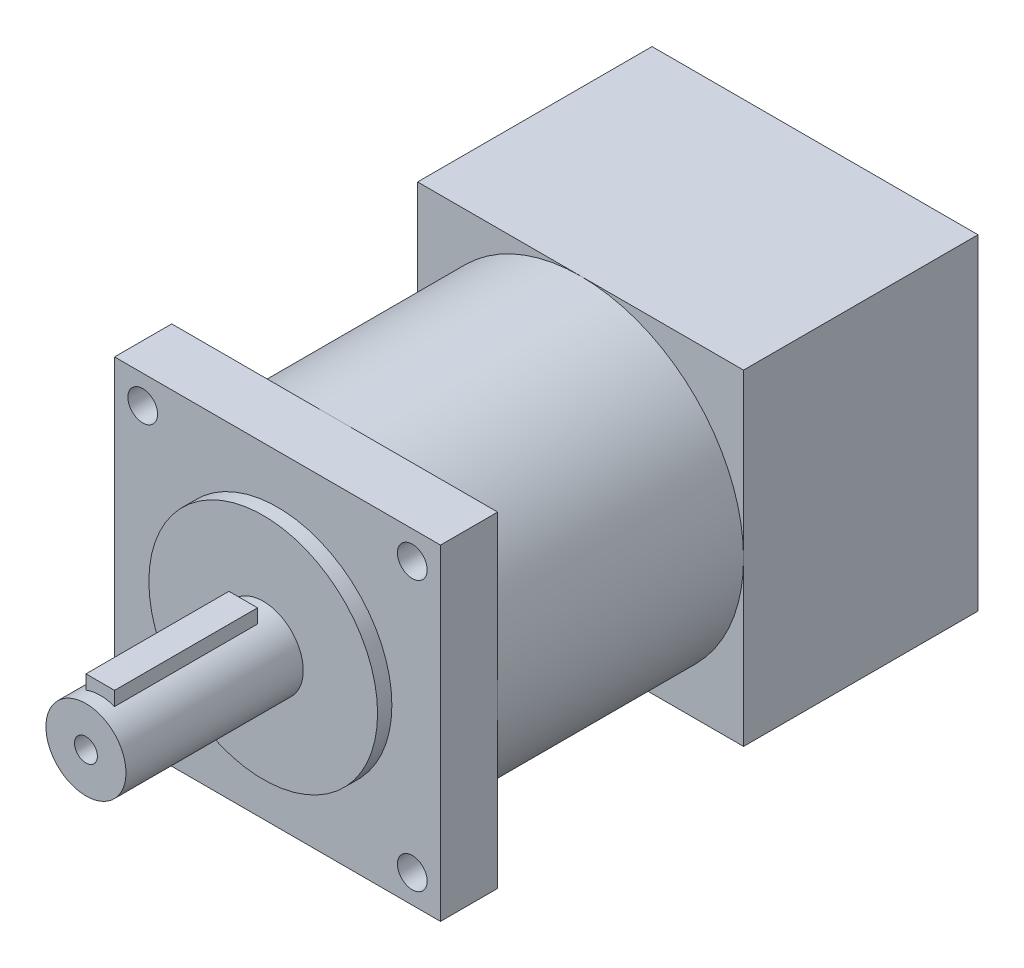
ISO-10303-21;
HEADER;
FILE_DESCRIPTION(('STEP AP214'),'2;1');
FILE_NAME('part.step','',(''),(''),'','','');
FILE_SCHEMA(('AUTOMOTIVE_DESIGN { 1 0 10303 214 1 1 1 1 }'));
ENDSEC;
DATA;
#1=APPLICATION_CONTEXT('core data for automotive mechanical design processes');
#2=APPLICATION_PROTOCOL_DEFINITION('international standard','automotive_design',2000,#1);
#3=PRODUCT_CONTEXT('',#1,'mechanical');
#4=PRODUCT('Part','Part','',(#3));
#5=PRODUCT_RELATED_PRODUCT_CATEGORY('part','',(#4));
#6=PRODUCT_DEFINITION_FORMATION('','',#4);
#7=PRODUCT_DEFINITION_CONTEXT('part definition',#1,'design');
#8=PRODUCT_DEFINITION('design','',#6,#7);
#9=PRODUCT_DEFINITION_SHAPE('','',#8);
#10=(LENGTH_UNIT() NAMED_UNIT(*) SI_UNIT(.MILLI.,.METRE.));
#11=(NAMED_UNIT(*) PLANE_ANGLE_UNIT() SI_UNIT($,.RADIAN.));
#12=(NAMED_UNIT(*) SI_UNIT($,.STERADIAN.) SOLID_ANGLE_UNIT());
#13=UNCERTAINTY_MEASURE_WITH_UNIT(LENGTH_MEASURE(1.E-05),#10,'distance_accuracy_value','');
#14=(GEOMETRIC_REPRESENTATION_CONTEXT(3) GLOBAL_UNCERTAINTY_ASSIGNED_CONTEXT((#13)) GLOBAL_UNIT_ASSIGNED_CONTEXT((#10,
#11,#12)) REPRESENTATION_CONTEXT('',''));
#15=CARTESIAN_POINT('',(0.,0.,0.));
#16=DIRECTION('',(0.,0.,1.));
#17=DIRECTION('',(1.,0.,0.));
#18=AXIS2_PLACEMENT_3D('',#15,#16,#17);
#19=CARTESIAN_POINT('',(0.,0.,127.5));
#20=DIRECTION('',(0.,0.,-1.));
#21=DIRECTION('',(-1.,0.,0.));
#22=AXIS2_PLACEMENT_3D('',#19,#20,#21);
#23=CYLINDRICAL_SURFACE('',#22,7.);
#24=CARTESIAN_POINT('',(0.,0.,96.5));
#25=DIRECTION('',(0.,0.,1.));
#26=DIRECTION('',(1.,0.,0.));
#27=AXIS2_PLACEMENT_3D('',#24,#25,#26);
#28=CIRCLE('',#27,7.);
#29=CARTESIAN_POINT('',(7.,0.,96.5));
#30=VERTEX_POINT('',#29);
#31=EDGE_CURVE('E246',#30,#30,#28,.T.);
#32=ORIENTED_EDGE('',*,*,#31,.T.);
#33=EDGE_LOOP('',(#32));
#34=FACE_BOUND('',#33,.T.);
#35=CARTESIAN_POINT('',(0.,0.,127.5));
#36=DIRECTION('',(0.,0.,1.));
#37=DIRECTION('',(1.,0.,0.));
#38=AXIS2_PLACEMENT_3D('',#35,#36,#37);
#39=CIRCLE('',#38,7.);
#40=CARTESIAN_POINT('',(7.,0.,127.5));
#41=VERTEX_POINT('',#40);
#42=EDGE_CURVE('E234',#41,#41,#39,.T.);
#43=ORIENTED_EDGE('',*,*,#42,.F.);
#44=EDGE_LOOP('',(#43));
#45=FACE_BOUND('',#44,.T.);
#46=CARTESIAN_POINT('',(0.,0.,100.));
#47=DIRECTION('',(0.,0.,1.));
#48=DIRECTION('',(1.,0.,0.));
#49=AXIS2_PLACEMENT_3D('',#46,#47,#48);
#50=CIRCLE('',#49,7.);
#51=CARTESIAN_POINT('',(2.5,6.53834841531101,100.));
#52=VERTEX_POINT('',#51);
#53=CARTESIAN_POINT('',(-2.5,6.53834841531101,100.));
#54=VERTEX_POINT('',#53);
#55=EDGE_CURVE('E11',#52,#54,#50,.T.);
#56=ORIENTED_EDGE('',*,*,#55,.F.);
#57=DIRECTION('',(0.,0.,-1.));
#58=VECTOR('',#57,1.);
#59=CARTESIAN_POINT('',(2.5,6.53834841531101,127.5));
#60=LINE('',#59,#58);
#61=CARTESIAN_POINT('',(2.5,6.53834841531101,125.));
#62=VERTEX_POINT('',#61);
#63=EDGE_CURVE('E156',#52,#62,#60,.F.);
#64=ORIENTED_EDGE('',*,*,#63,.T.);
#65=CARTESIAN_POINT('',(0.,0.,125.));
#66=DIRECTION('',(0.,0.,1.));
#67=DIRECTION('',(1.,0.,0.));
#68=AXIS2_PLACEMENT_3D('',#65,#66,#67);
#69=CIRCLE('',#68,7.);
#70=CARTESIAN_POINT('',(-2.5,6.53834841531101,125.));
#71=VERTEX_POINT('',#70);
#72=EDGE_CURVE('E300',#62,#71,#69,.T.);
#73=ORIENTED_EDGE('',*,*,#72,.T.);
#74=DIRECTION('',(0.,0.,-1.));
#75=VECTOR('',#74,1.);
#76=CARTESIAN_POINT('',(-2.5,6.53834841531101,127.5));
#77=LINE('',#76,#75);
#78=EDGE_CURVE('E43',#71,#54,#77,.T.);
#79=ORIENTED_EDGE('',*,*,#78,.T.);
#80=EDGE_LOOP('',(#56,#64,#73,#79));
#81=FACE_BOUND('',#80,.T.);
#82=ADVANCED_FACE('F35',(#34,#45,#81),#23,.T.);
#83=CARTESIAN_POINT('',(0.,0.,94.));
#84=DIRECTION('',(0.,0.,1.));
#85=DIRECTION('',(1.,0.,0.));
#86=AXIS2_PLACEMENT_3D('',#83,#84,#85);
#87=PLANE('',#86);
#88=CARTESIAN_POINT('',(0.,0.,94.));
#89=DIRECTION('',(0.,0.,1.));
#90=DIRECTION('',(1.,0.,0.));
#91=AXIS2_PLACEMENT_3D('',#88,#89,#90);
#92=CIRCLE('',#91,20.);
#93=CARTESIAN_POINT('',(20.,0.,94.));
#94=VERTEX_POINT('',#93);
#95=EDGE_CURVE('E250',#94,#94,#92,.T.);
#96=ORIENTED_EDGE('',*,*,#95,.F.);
#97=EDGE_LOOP('',(#96));
#98=FACE_BOUND('',#97,.T.);
#99=DIRECTION('',(1.,0.,0.));
#100=VECTOR('',#99,1.);
#101=CARTESIAN_POINT('',(-28.5,-28.5,94.));
#102=LINE('',#101,#100);
#103=CARTESIAN_POINT('',(-28.5,-28.5,94.));
#104=VERTEX_POINT('',#103);
#105=CARTESIAN_POINT('',(28.5,-28.5,94.));
#106=VERTEX_POINT('',#105);
#107=EDGE_CURVE('E228',#104,#106,#102,.T.);
#108=ORIENTED_EDGE('',*,*,#107,.T.);
#109=DIRECTION('',(0.,1.,0.));
#110=VECTOR('',#109,1.);
#111=CARTESIAN_POINT('',(28.5,-28.5,94.));
#112=LINE('',#111,#110);
#113=CARTESIAN_POINT('',(28.5,28.5,94.));
#114=VERTEX_POINT('',#113);
#115=EDGE_CURVE('E203',#106,#114,#112,.T.);
#116=ORIENTED_EDGE('',*,*,#115,.T.);
#117=DIRECTION('',(-1.,0.,0.));
#118=VECTOR('',#117,1.);
#119=CARTESIAN_POINT('',(-28.5,28.5,94.));
#120=LINE('',#119,#118);
#121=CARTESIAN_POINT('',(-28.5,28.5,94.));
#122=VERTEX_POINT('',#121);
#123=EDGE_CURVE('E223',#114,#122,#120,.T.);
#124=ORIENTED_EDGE('',*,*,#123,.T.);
#125=DIRECTION('',(0.,-1.,0.));
#126=VECTOR('',#125,1.);
#127=CARTESIAN_POINT('',(-28.5,-28.5,94.));
#128=LINE('',#127,#126);
#129=EDGE_CURVE('E225',#122,#104,#128,.T.);
#130=ORIENTED_EDGE('',*,*,#129,.T.);
#131=EDGE_LOOP('',(#108,#116,#124,#130));
#132=FACE_BOUND('',#131,.T.);
#133=CARTESIAN_POINT('',(-23.5699999999987,-23.57,94.));
#134=DIRECTION('',(0.,0.,1.));
#135=DIRECTION('',(1.,0.,0.));
#136=AXIS2_PLACEMENT_3D('',#133,#134,#135);
#137=CIRCLE('',#136,2.60000000000069);
#138=CARTESIAN_POINT('',(-20.969999999998,-23.57,94.));
#139=VERTEX_POINT('',#138);
#140=EDGE_CURVE('E180',#139,#139,#137,.T.);
#141=ORIENTED_EDGE('',*,*,#140,.F.);
#142=EDGE_LOOP('',(#141));
#143=FACE_BOUND('',#142,.T.);
#144=CARTESIAN_POINT('',(23.5700000000013,-23.5699999999987,94.));
#145=DIRECTION('',(0.,0.,1.));
#146=DIRECTION('',(1.,0.,0.));
#147=AXIS2_PLACEMENT_3D('',#144,#145,#146);
#148=CIRCLE('',#147,2.60000000000186);
#149=CARTESIAN_POINT('',(26.1700000000032,-23.5699999999987,94.));
#150=VERTEX_POINT('',#149);
#151=EDGE_CURVE('E185',#150,#150,#148,.T.);
#152=ORIENTED_EDGE('',*,*,#151,.F.);
#153=EDGE_LOOP('',(#152));
#154=FACE_BOUND('',#153,.T.);
#155=CARTESIAN_POINT('',(23.57,23.5700000000013,94.));
#156=DIRECTION('',(0.,0.,1.));
#157=DIRECTION('',(1.,0.,0.));
#158=AXIS2_PLACEMENT_3D('',#155,#156,#157);
#159=CIRCLE('',#158,2.60000000000137);
#160=CARTESIAN_POINT('',(26.1700000000014,23.5700000000013,94.));
#161=VERTEX_POINT('',#160);
#162=EDGE_CURVE('E191',#161,#161,#159,.T.);
#163=ORIENTED_EDGE('',*,*,#162,.F.);
#164=EDGE_LOOP('',(#163));
#165=FACE_BOUND('',#164,.T.);
#166=CARTESIAN_POINT('',(-23.57,23.57,94.));
#167=DIRECTION('',(0.,0.,1.));
#168=DIRECTION('',(1.,0.,0.));
#169=AXIS2_PLACEMENT_3D('',#166,#167,#168);
#170=CIRCLE('',#169,2.6);
#171=CARTESIAN_POINT('',(-20.97,23.57,94.));
#172=VERTEX_POINT('',#171);
#173=EDGE_CURVE('E197',#172,#172,#170,.T.);
#174=ORIENTED_EDGE('',*,*,#173,.F.);
#175=EDGE_LOOP('',(#174));
#176=FACE_BOUND('',#175,.T.);
#177=ADVANCED_FACE('F332',(#98,#132,#143,#154,#165,#176),#87,.T.);
#178=CARTESIAN_POINT('',(0.,0.,96.5));
#179=DIRECTION('',(0.,0.,-1.));
#180=DIRECTION('',(-1.,0.,0.));
#181=AXIS2_PLACEMENT_3D('',#178,#179,#180);
#182=CYLINDRICAL_SURFACE('',#181,20.);
#183=CARTESIAN_POINT('',(0.,0.,96.5));
#184=DIRECTION('',(0.,0.,1.));
#185=DIRECTION('',(1.,0.,0.));
#186=AXIS2_PLACEMENT_3D('',#183,#184,#185);
#187=CIRCLE('',#186,20.);
#188=CARTESIAN_POINT('',(20.,0.,96.5));
#189=VERTEX_POINT('',#188);
#190=EDGE_CURVE('E245',#189,#189,#187,.T.);
#191=ORIENTED_EDGE('',*,*,#190,.F.);
#192=EDGE_LOOP('',(#191));
#193=FACE_BOUND('',#192,.T.);
#194=ORIENTED_EDGE('',*,*,#95,.T.);
#195=EDGE_LOOP('',(#194));
#196=FACE_BOUND('',#195,.T.);
#197=ADVANCED_FACE('F338',(#193,#196),#182,.T.);
#198=CARTESIAN_POINT('',(0.,0.,96.5));
#199=DIRECTION('',(0.,0.,1.));
#200=DIRECTION('',(1.,0.,0.));
#201=AXIS2_PLACEMENT_3D('',#198,#199,#200);
#202=PLANE('',#201);
#203=ORIENTED_EDGE('',*,*,#31,.F.);
#204=EDGE_LOOP('',(#203));
#205=FACE_BOUND('',#204,.T.);
#206=ORIENTED_EDGE('',*,*,#190,.T.);
#207=EDGE_LOOP('',(#206));
#208=FACE_BOUND('',#207,.T.);
#209=ADVANCED_FACE('F327',(#205,#208),#202,.T.);
#210=CARTESIAN_POINT('',(0.,0.,127.5));
#211=DIRECTION('',(0.,0.,1.));
#212=DIRECTION('',(1.,0.,0.));
#213=AXIS2_PLACEMENT_3D('',#210,#211,#212);
#214=PLANE('',#213);
#215=CARTESIAN_POINT('',(0.,0.,127.5));
#216=DIRECTION('',(0.,0.,1.));
#217=DIRECTION('',(1.,0.,0.));
#218=AXIS2_PLACEMENT_3D('',#215,#216,#217);
#219=CIRCLE('',#218,2.);
#220=CARTESIAN_POINT('',(2.,0.,127.5));
#221=VERTEX_POINT('',#220);
#222=EDGE_CURVE('E308',#221,#221,#219,.T.);
#223=ORIENTED_EDGE('',*,*,#222,.F.);
#224=EDGE_LOOP('',(#223));
#225=FACE_BOUND('',#224,.T.);
#226=ORIENTED_EDGE('',*,*,#42,.T.);
#227=EDGE_LOOP('',(#226));
#228=FACE_BOUND('',#227,.T.);
#229=ADVANCED_FACE('F323',(#225,#228),#214,.T.);
#230=CARTESIAN_POINT('',(0.,0.,84.));
#231=DIRECTION('',(0.,0.,-1.));
#232=DIRECTION('',(-1.,0.,0.));
#233=AXIS2_PLACEMENT_3D('',#230,#231,#232);
#234=PLANE('',#233);
#235=CARTESIAN_POINT('',(0.,0.,84.));
#236=DIRECTION('',(0.,0.,-1.));
#237=DIRECTION('',(-1.,0.,0.));
#238=AXIS2_PLACEMENT_3D('',#235,#236,#237);
#239=CIRCLE('',#238,28.5);
#240=CARTESIAN_POINT('',(-28.5,0.,84.));
#241=VERTEX_POINT('',#240);
#242=CARTESIAN_POINT('',(0.,28.5,84.));
#243=VERTEX_POINT('',#242);
#244=EDGE_CURVE('E299',#241,#243,#239,.T.);
#245=ORIENTED_EDGE('',*,*,#244,.F.);
#246=DIRECTION('',(0.,-1.,0.));
#247=VECTOR('',#246,1.);
#248=CARTESIAN_POINT('',(-28.5,-28.5,84.));
#249=LINE('',#248,#247);
#250=CARTESIAN_POINT('',(-28.5,28.5,84.));
#251=VERTEX_POINT('',#250);
#252=EDGE_CURVE('E58',#251,#241,#249,.T.);
#253=ORIENTED_EDGE('',*,*,#252,.F.);
#254=DIRECTION('',(-1.,0.,0.));
#255=VECTOR('',#254,1.);
#256=CARTESIAN_POINT('',(-28.5,28.5,84.));
#257=LINE('',#256,#255);
#258=EDGE_CURVE('E209',#243,#251,#257,.T.);
#259=ORIENTED_EDGE('',*,*,#258,.F.);
#260=EDGE_LOOP('',(#245,#253,#259));
#261=FACE_BOUND('',#260,.T.);
#262=CARTESIAN_POINT('',(-23.57,23.57,84.));
#263=DIRECTION('',(0.,0.,1.));
#264=DIRECTION('',(1.,0.,0.));
#265=AXIS2_PLACEMENT_3D('',#262,#263,#264);
#266=CIRCLE('',#265,2.6);
#267=CARTESIAN_POINT('',(-20.97,23.57,84.));
#268=VERTEX_POINT('',#267);
#269=EDGE_CURVE('E200',#268,#268,#266,.T.);
#270=ORIENTED_EDGE('',*,*,#269,.T.);
#271=EDGE_LOOP('',(#270));
#272=FACE_BOUND('',#271,.T.);
#273=ADVANCED_FACE('F326',(#261,#272),#234,.T.);
#274=CARTESIAN_POINT('',(28.5,0.,84.));
#275=VERTEX_POINT('',#274);
#276=EDGE_CURVE('E671',#243,#275,#239,.T.);
#277=ORIENTED_EDGE('',*,*,#276,.F.);
#278=CARTESIAN_POINT('',(28.5,28.5,84.));
#279=VERTEX_POINT('',#278);
#280=EDGE_CURVE('E211',#279,#243,#257,.T.);
#281=ORIENTED_EDGE('',*,*,#280,.F.);
#282=DIRECTION('',(0.,1.,0.));
#283=VECTOR('',#282,1.);
#284=CARTESIAN_POINT('',(28.5,-28.5,84.));
#285=LINE('',#284,#283);
#286=EDGE_CURVE('E210',#275,#279,#285,.T.);
#287=ORIENTED_EDGE('',*,*,#286,.F.);
#288=EDGE_LOOP('',(#277,#281,#287));
#289=FACE_BOUND('',#288,.T.);
#290=CARTESIAN_POINT('',(23.57,23.5700000000013,84.));
#291=DIRECTION('',(0.,0.,1.));
#292=DIRECTION('',(1.,0.,0.));
#293=AXIS2_PLACEMENT_3D('',#290,#291,#292);
#294=CIRCLE('',#293,2.60000000000137);
#295=CARTESIAN_POINT('',(26.1700000000014,23.5700000000013,84.));
#296=VERTEX_POINT('',#295);
#297=EDGE_CURVE('E194',#296,#296,#294,.T.);
#298=ORIENTED_EDGE('',*,*,#297,.T.);
#299=EDGE_LOOP('',(#298));
#300=FACE_BOUND('',#299,.T.);
#301=ADVANCED_FACE('F520',(#289,#300),#234,.T.);
#302=CARTESIAN_POINT('',(0.,-28.5,84.));
#303=VERTEX_POINT('',#302);
#304=EDGE_CURVE('E298',#275,#303,#239,.T.);
#305=ORIENTED_EDGE('',*,*,#304,.F.);
#306=CARTESIAN_POINT('',(28.5,-28.5,84.));
#307=VERTEX_POINT('',#306);
#308=EDGE_CURVE('E206',#307,#275,#285,.T.);
#309=ORIENTED_EDGE('',*,*,#308,.F.);
#310=DIRECTION('',(1.,0.,0.));
#311=VECTOR('',#310,1.);
#312=CARTESIAN_POINT('',(-28.5,-28.5,84.));
#313=LINE('',#312,#311);
#314=EDGE_CURVE('E216',#303,#307,#313,.T.);
#315=ORIENTED_EDGE('',*,*,#314,.F.);
#316=EDGE_LOOP('',(#305,#309,#315));
#317=FACE_BOUND('',#316,.T.);
#318=CARTESIAN_POINT('',(23.5700000000013,-23.5699999999987,84.));
#319=DIRECTION('',(0.,0.,1.));
#320=DIRECTION('',(1.,0.,0.));
#321=AXIS2_PLACEMENT_3D('',#318,#319,#320);
#322=CIRCLE('',#321,2.60000000000186);
#323=CARTESIAN_POINT('',(26.1700000000032,-23.5699999999987,84.));
#324=VERTEX_POINT('',#323);
#325=EDGE_CURVE('E188',#324,#324,#322,.T.);
#326=ORIENTED_EDGE('',*,*,#325,.T.);
#327=EDGE_LOOP('',(#326));
#328=FACE_BOUND('',#327,.T.);
#329=ADVANCED_FACE('F485',(#317,#328),#234,.T.);
#330=CARTESIAN_POINT('',(28.5,-28.5,84.));
#331=DIRECTION('',(1.,0.,0.));
#332=DIRECTION('',(0.,0.,-1.));
#333=AXIS2_PLACEMENT_3D('',#330,#331,#332);
#334=PLANE('',#333);
#335=ORIENTED_EDGE('',*,*,#308,.T.);
#336=ORIENTED_EDGE('',*,*,#286,.T.);
#337=DIRECTION('',(0.,0.,1.));
#338=VECTOR('',#337,1.);
#339=CARTESIAN_POINT('',(28.5,28.5,84.));
#340=LINE('',#339,#338);
#341=EDGE_CURVE('E220',#279,#114,#340,.T.);
#342=ORIENTED_EDGE('',*,*,#341,.T.);
#343=ORIENTED_EDGE('',*,*,#115,.F.);
#344=DIRECTION('',(0.,0.,1.));
#345=VECTOR('',#344,1.);
#346=CARTESIAN_POINT('',(28.5,-28.5,84.));
#347=LINE('',#346,#345);
#348=EDGE_CURVE('E231',#307,#106,#347,.T.);
#349=ORIENTED_EDGE('',*,*,#348,.F.);
#350=EDGE_LOOP('',(#335,#336,#342,#343,#349));
#351=FACE_BOUND('',#350,.T.);
#352=ADVANCED_FACE('F506',(#351),#334,.T.);
#353=CARTESIAN_POINT('',(-28.5,-28.5,84.));
#354=DIRECTION('',(0.,-1.,0.));
#355=DIRECTION('',(0.,0.,-1.));
#356=AXIS2_PLACEMENT_3D('',#353,#354,#355);
#357=PLANE('',#356);
#358=CARTESIAN_POINT('',(-28.5,-28.5,84.));
#359=VERTEX_POINT('',#358);
#360=EDGE_CURVE('E217',#359,#303,#313,.T.);
#361=ORIENTED_EDGE('',*,*,#360,.T.);
#362=ORIENTED_EDGE('',*,*,#314,.T.);
#363=ORIENTED_EDGE('',*,*,#348,.T.);
#364=ORIENTED_EDGE('',*,*,#107,.F.);
#365=DIRECTION('',(0.,0.,1.));
#366=VECTOR('',#365,1.);
#367=CARTESIAN_POINT('',(-28.5,-28.5,84.));
#368=LINE('',#367,#366);
#369=EDGE_CURVE('E235',#359,#104,#368,.T.);
#370=ORIENTED_EDGE('',*,*,#369,.F.);
#371=EDGE_LOOP('',(#361,#362,#363,#364,#370));
#372=FACE_BOUND('',#371,.T.);
#373=ADVANCED_FACE('F499',(#372),#357,.T.);
#374=CARTESIAN_POINT('',(-28.5,-28.5,84.));
#375=DIRECTION('',(-1.,0.,0.));
#376=DIRECTION('',(0.,0.,1.));
#377=AXIS2_PLACEMENT_3D('',#374,#375,#376);
#378=PLANE('',#377);
#379=ORIENTED_EDGE('',*,*,#252,.T.);
#380=EDGE_CURVE('E214',#241,#359,#249,.T.);
#381=ORIENTED_EDGE('',*,*,#380,.T.);
#382=ORIENTED_EDGE('',*,*,#369,.T.);
#383=ORIENTED_EDGE('',*,*,#129,.F.);
#384=DIRECTION('',(0.,0.,1.));
#385=VECTOR('',#384,1.);
#386=CARTESIAN_POINT('',(-28.5,28.5,84.));
#387=LINE('',#386,#385);
#388=EDGE_CURVE('E238',#251,#122,#387,.T.);
#389=ORIENTED_EDGE('',*,*,#388,.F.);
#390=EDGE_LOOP('',(#379,#381,#382,#383,#389));
#391=FACE_BOUND('',#390,.T.);
#392=ADVANCED_FACE('F491',(#391),#378,.T.);
#393=CARTESIAN_POINT('',(-28.5,28.5,84.));
#394=DIRECTION('',(0.,1.,0.));
#395=DIRECTION('',(0.,0.,1.));
#396=AXIS2_PLACEMENT_3D('',#393,#394,#395);
#397=PLANE('',#396);
#398=ORIENTED_EDGE('',*,*,#280,.T.);
#399=ORIENTED_EDGE('',*,*,#258,.T.);
#400=ORIENTED_EDGE('',*,*,#388,.T.);
#401=ORIENTED_EDGE('',*,*,#123,.F.);
#402=ORIENTED_EDGE('',*,*,#341,.F.);
#403=EDGE_LOOP('',(#398,#399,#400,#401,#402));
#404=FACE_BOUND('',#403,.T.);
#405=ADVANCED_FACE('F482',(#404),#397,.T.);
#406=EDGE_CURVE('E249',#303,#241,#239,.T.);
#407=ORIENTED_EDGE('',*,*,#406,.F.);
#408=ORIENTED_EDGE('',*,*,#360,.F.);
#409=ORIENTED_EDGE('',*,*,#380,.F.);
#410=EDGE_LOOP('',(#407,#408,#409));
#411=FACE_BOUND('',#410,.T.);
#412=CARTESIAN_POINT('',(-23.5699999999987,-23.57,84.));
#413=DIRECTION('',(0.,0.,1.));
#414=DIRECTION('',(1.,0.,0.));
#415=AXIS2_PLACEMENT_3D('',#412,#413,#414);
#416=CIRCLE('',#415,2.60000000000069);
#417=CARTESIAN_POINT('',(-20.969999999998,-23.57,84.));
#418=VERTEX_POINT('',#417);
#419=EDGE_CURVE('E182',#418,#418,#416,.T.);
#420=ORIENTED_EDGE('',*,*,#419,.T.);
#421=EDGE_LOOP('',(#420));
#422=FACE_BOUND('',#421,.T.);
#423=ADVANCED_FACE('F474',(#411,#422),#234,.T.);
#424=CARTESIAN_POINT('',(-23.57,23.57,84.));
#425=DIRECTION('',(0.,0.,1.));
#426=DIRECTION('',(1.,0.,0.));
#427=AXIS2_PLACEMENT_3D('',#424,#425,#426);
#428=CYLINDRICAL_SURFACE('',#427,2.6);
#429=ORIENTED_EDGE('',*,*,#269,.F.);
#430=EDGE_LOOP('',(#429));
#431=FACE_BOUND('',#430,.T.);
#432=ORIENTED_EDGE('',*,*,#173,.T.);
#433=EDGE_LOOP('',(#432));
#434=FACE_BOUND('',#433,.T.);
#435=ADVANCED_FACE('F466',(#431,#434),#428,.F.);
#436=CARTESIAN_POINT('',(23.57,23.5700000000013,84.));
#437=DIRECTION('',(0.,0.,1.));
#438=DIRECTION('',(1.,0.,0.));
#439=AXIS2_PLACEMENT_3D('',#436,#437,#438);
#440=CYLINDRICAL_SURFACE('',#439,2.60000000000137);
#441=ORIENTED_EDGE('',*,*,#297,.F.);
#442=EDGE_LOOP('',(#441));
#443=FACE_BOUND('',#442,.T.);
#444=ORIENTED_EDGE('',*,*,#162,.T.);
#445=EDGE_LOOP('',(#444));
#446=FACE_BOUND('',#445,.T.);
#447=ADVANCED_FACE('F458',(#443,#446),#440,.F.);
#448=CARTESIAN_POINT('',(23.5700000000013,-23.5699999999987,84.));
#449=DIRECTION('',(0.,0.,1.));
#450=DIRECTION('',(1.,0.,0.));
#451=AXIS2_PLACEMENT_3D('',#448,#449,#450);
#452=CYLINDRICAL_SURFACE('',#451,2.60000000000186);
#453=ORIENTED_EDGE('',*,*,#325,.F.);
#454=EDGE_LOOP('',(#453));
#455=FACE_BOUND('',#454,.T.);
#456=ORIENTED_EDGE('',*,*,#151,.T.);
#457=EDGE_LOOP('',(#456));
#458=FACE_BOUND('',#457,.T.);
#459=ADVANCED_FACE('F449',(#455,#458),#452,.F.);
#460=CARTESIAN_POINT('',(-23.5699999999987,-23.57,84.));
#461=DIRECTION('',(0.,0.,1.));
#462=DIRECTION('',(1.,0.,0.));
#463=AXIS2_PLACEMENT_3D('',#460,#461,#462);
#464=CYLINDRICAL_SURFACE('',#463,2.60000000000069);
#465=ORIENTED_EDGE('',*,*,#419,.F.);
#466=EDGE_LOOP('',(#465));
#467=FACE_BOUND('',#466,.T.);
#468=ORIENTED_EDGE('',*,*,#140,.T.);
#469=EDGE_LOOP('',(#468));
#470=FACE_BOUND('',#469,.T.);
#471=ADVANCED_FACE('F363',(#467,#470),#464,.F.);
#472=CARTESIAN_POINT('',(0.,0.,0.));
#473=DIRECTION('',(0.,0.,1.));
#474=DIRECTION('',(1.,0.,0.));
#475=AXIS2_PLACEMENT_3D('',#472,#473,#474);
#476=PLANE('',#475);
#477=DIRECTION('',(0.,1.,0.));
#478=VECTOR('',#477,1.);
#479=CARTESIAN_POINT('',(28.5,28.5,0.));
#480=LINE('',#479,#478);
#481=CARTESIAN_POINT('',(28.5,-28.5,0.));
#482=VERTEX_POINT('',#481);
#483=CARTESIAN_POINT('',(28.5,28.5,0.));
#484=VERTEX_POINT('',#483);
#485=EDGE_CURVE('E259',#482,#484,#480,.T.);
#486=ORIENTED_EDGE('',*,*,#485,.F.);
#487=DIRECTION('',(1.,0.,0.));
#488=VECTOR('',#487,1.);
#489=CARTESIAN_POINT('',(-28.5,-28.5,0.));
#490=LINE('',#489,#488);
#491=CARTESIAN_POINT('',(-28.5,-28.5,0.));
#492=VERTEX_POINT('',#491);
#493=EDGE_CURVE('E283',#492,#482,#490,.T.);
#494=ORIENTED_EDGE('',*,*,#493,.F.);
#495=DIRECTION('',(0.,-1.,0.));
#496=VECTOR('',#495,1.);
#497=CARTESIAN_POINT('',(-28.5,28.5,0.));
#498=LINE('',#497,#496);
#499=CARTESIAN_POINT('',(-28.5,28.5,0.));
#500=VERTEX_POINT('',#499);
#501=EDGE_CURVE('E281',#500,#492,#498,.T.);
#502=ORIENTED_EDGE('',*,*,#501,.F.);
#503=DIRECTION('',(-1.,0.,0.));
#504=VECTOR('',#503,1.);
#505=CARTESIAN_POINT('',(-28.5,28.5,0.));
#506=LINE('',#505,#504);
#507=EDGE_CURVE('E279',#484,#500,#506,.T.);
#508=ORIENTED_EDGE('',*,*,#507,.F.);
#509=EDGE_LOOP('',(#486,#494,#502,#508));
#510=FACE_BOUND('',#509,.T.);
#511=ADVANCED_FACE('F359',(#510),#476,.F.);
#512=CARTESIAN_POINT('',(-28.5,-28.5,41.));
#513=DIRECTION('',(0.,1.,0.));
#514=DIRECTION('',(0.,0.,1.));
#515=AXIS2_PLACEMENT_3D('',#512,#513,#514);
#516=PLANE('',#515);
#517=ORIENTED_EDGE('',*,*,#493,.T.);
#518=DIRECTION('',(0.,0.,-1.));
#519=VECTOR('',#518,1.);
#520=CARTESIAN_POINT('',(28.5,-28.5,41.));
#521=LINE('',#520,#519);
#522=CARTESIAN_POINT('',(28.5,-28.5,41.));
#523=VERTEX_POINT('',#522);
#524=EDGE_CURVE('E276',#523,#482,#521,.T.);
#525=ORIENTED_EDGE('',*,*,#524,.F.);
#526=DIRECTION('',(1.,0.,0.));
#527=VECTOR('',#526,1.);
#528=CARTESIAN_POINT('',(-28.5,-28.5,41.));
#529=LINE('',#528,#527);
#530=CARTESIAN_POINT('',(0.,-28.5,41.));
#531=VERTEX_POINT('',#530);
#532=EDGE_CURVE('E272',#531,#523,#529,.T.);
#533=ORIENTED_EDGE('',*,*,#532,.F.);
#534=CARTESIAN_POINT('',(-28.5,-28.5,41.));
#535=VERTEX_POINT('',#534);
#536=EDGE_CURVE('E273',#535,#531,#529,.T.);
#537=ORIENTED_EDGE('',*,*,#536,.F.);
#538=DIRECTION('',(0.,0.,-1.));
#539=VECTOR('',#538,1.);
#540=CARTESIAN_POINT('',(-28.5,-28.5,41.));
#541=LINE('',#540,#539);
#542=EDGE_CURVE('E287',#535,#492,#541,.T.);
#543=ORIENTED_EDGE('',*,*,#542,.T.);
#544=EDGE_LOOP('',(#517,#525,#533,#537,#543));
#545=FACE_BOUND('',#544,.T.);
#546=ADVANCED_FACE('F362',(#545),#516,.F.);
#547=CARTESIAN_POINT('',(-28.5,28.5,41.));
#548=DIRECTION('',(1.,0.,0.));
#549=DIRECTION('',(0.,1.,0.));
#550=AXIS2_PLACEMENT_3D('',#547,#548,#549);
#551=PLANE('',#550);
#552=ORIENTED_EDGE('',*,*,#501,.T.);
#553=ORIENTED_EDGE('',*,*,#542,.F.);
#554=DIRECTION('',(0.,-1.,0.));
#555=VECTOR('',#554,1.);
#556=CARTESIAN_POINT('',(-28.5,28.5,41.));
#557=LINE('',#556,#555);
#558=CARTESIAN_POINT('',(-28.5,0.,41.));
#559=VERTEX_POINT('',#558);
#560=EDGE_CURVE('E268',#559,#535,#557,.T.);
#561=ORIENTED_EDGE('',*,*,#560,.F.);
#562=CARTESIAN_POINT('',(-28.5,28.5,41.));
#563=VERTEX_POINT('',#562);
#564=EDGE_CURVE('E269',#563,#559,#557,.T.);
#565=ORIENTED_EDGE('',*,*,#564,.F.);
#566=DIRECTION('',(0.,0.,-1.));
#567=VECTOR('',#566,1.);
#568=CARTESIAN_POINT('',(-28.5,28.5,41.));
#569=LINE('',#568,#567);
#570=EDGE_CURVE('E290',#563,#500,#569,.T.);
#571=ORIENTED_EDGE('',*,*,#570,.T.);
#572=EDGE_LOOP('',(#552,#553,#561,#565,#571));
#573=FACE_BOUND('',#572,.T.);
#574=ADVANCED_FACE('F367',(#573),#551,.F.);
#575=CARTESIAN_POINT('',(-28.5,28.5,41.));
#576=DIRECTION('',(0.,-1.,0.));
#577=DIRECTION('',(0.,0.,-1.));
#578=AXIS2_PLACEMENT_3D('',#575,#576,#577);
#579=PLANE('',#578);
#580=ORIENTED_EDGE('',*,*,#507,.T.);
#581=ORIENTED_EDGE('',*,*,#570,.F.);
#582=DIRECTION('',(-1.,0.,0.));
#583=VECTOR('',#582,1.);
#584=CARTESIAN_POINT('',(-28.5,28.5,41.));
#585=LINE('',#584,#583);
#586=CARTESIAN_POINT('',(0.,28.5,41.));
#587=VERTEX_POINT('',#586);
#588=EDGE_CURVE('E263',#587,#563,#585,.T.);
#589=ORIENTED_EDGE('',*,*,#588,.F.);
#590=CARTESIAN_POINT('',(28.5,28.5,41.));
#591=VERTEX_POINT('',#590);
#592=EDGE_CURVE('E265',#591,#587,#585,.T.);
#593=ORIENTED_EDGE('',*,*,#592,.F.);
#594=DIRECTION('',(0.,0.,-1.));
#595=VECTOR('',#594,1.);
#596=CARTESIAN_POINT('',(28.5,28.5,41.));
#597=LINE('',#596,#595);
#598=EDGE_CURVE('E293',#591,#484,#597,.T.);
#599=ORIENTED_EDGE('',*,*,#598,.T.);
#600=EDGE_LOOP('',(#580,#581,#589,#593,#599));
#601=FACE_BOUND('',#600,.T.);
#602=ADVANCED_FACE('F370',(#601),#579,.F.);
#603=CARTESIAN_POINT('',(28.5,28.5,41.));
#604=DIRECTION('',(-1.,0.,0.));
#605=DIRECTION('',(0.,-1.,0.));
#606=AXIS2_PLACEMENT_3D('',#603,#604,#605);
#607=PLANE('',#606);
#608=ORIENTED_EDGE('',*,*,#485,.T.);
#609=ORIENTED_EDGE('',*,*,#598,.F.);
#610=DIRECTION('',(0.,1.,0.));
#611=VECTOR('',#610,1.);
#612=CARTESIAN_POINT('',(28.5,28.5,41.));
#613=LINE('',#612,#611);
#614=CARTESIAN_POINT('',(28.5,0.,41.));
#615=VERTEX_POINT('',#614);
#616=EDGE_CURVE('E264',#615,#591,#613,.T.);
#617=ORIENTED_EDGE('',*,*,#616,.F.);
#618=EDGE_CURVE('E261',#523,#615,#613,.T.);
#619=ORIENTED_EDGE('',*,*,#618,.F.);
#620=ORIENTED_EDGE('',*,*,#524,.T.);
#621=EDGE_LOOP('',(#608,#609,#617,#619,#620));
#622=FACE_BOUND('',#621,.T.);
#623=ADVANCED_FACE('F37',(#622),#607,.F.);
#624=CARTESIAN_POINT('',(0.,0.,41.));
#625=DIRECTION('',(0.,0.,1.));
#626=DIRECTION('',(1.,0.,0.));
#627=AXIS2_PLACEMENT_3D('',#624,#625,#626);
#628=PLANE('',#627);
#629=CARTESIAN_POINT('',(0.,0.,41.));
#630=DIRECTION('',(0.,0.,1.));
#631=DIRECTION('',(1.,0.,0.));
#632=AXIS2_PLACEMENT_3D('',#629,#630,#631);
#633=CIRCLE('',#632,28.5);
#634=EDGE_CURVE('E260',#531,#615,#633,.T.);
#635=ORIENTED_EDGE('',*,*,#634,.F.);
#636=ORIENTED_EDGE('',*,*,#532,.T.);
#637=ORIENTED_EDGE('',*,*,#618,.T.);
#638=EDGE_LOOP('',(#635,#636,#637));
#639=FACE_BOUND('',#638,.T.);
#640=ADVANCED_FACE('F354',(#639),#628,.T.);
#641=EDGE_CURVE('E397',#559,#531,#633,.T.);
#642=ORIENTED_EDGE('',*,*,#641,.F.);
#643=ORIENTED_EDGE('',*,*,#560,.T.);
#644=ORIENTED_EDGE('',*,*,#536,.T.);
#645=EDGE_LOOP('',(#642,#643,#644));
#646=FACE_BOUND('',#645,.T.);
#647=ADVANCED_FACE('F357',(#646),#628,.T.);
#648=EDGE_CURVE('E256',#587,#559,#633,.T.);
#649=ORIENTED_EDGE('',*,*,#648,.F.);
#650=ORIENTED_EDGE('',*,*,#588,.T.);
#651=ORIENTED_EDGE('',*,*,#564,.T.);
#652=EDGE_LOOP('',(#649,#650,#651));
#653=FACE_BOUND('',#652,.T.);
#654=ADVANCED_FACE('F401',(#653),#628,.T.);
#655=EDGE_CURVE('E253',#615,#587,#633,.T.);
#656=ORIENTED_EDGE('',*,*,#655,.F.);
#657=ORIENTED_EDGE('',*,*,#616,.T.);
#658=ORIENTED_EDGE('',*,*,#592,.T.);
#659=EDGE_LOOP('',(#656,#657,#658));
#660=FACE_BOUND('',#659,.T.);
#661=ADVANCED_FACE('F352',(#660),#628,.T.);
#662=CARTESIAN_POINT('',(0.,0.,94.));
#663=DIRECTION('',(0.,0.,-1.));
#664=DIRECTION('',(-1.,0.,0.));
#665=AXIS2_PLACEMENT_3D('',#662,#663,#664);
#666=CYLINDRICAL_SURFACE('',#665,28.5);
#667=ORIENTED_EDGE('',*,*,#406,.T.);
#668=ORIENTED_EDGE('',*,*,#244,.T.);
#669=ORIENTED_EDGE('',*,*,#276,.T.);
#670=ORIENTED_EDGE('',*,*,#304,.T.);
#671=EDGE_LOOP('',(#667,#668,#669,#670));
#672=FACE_BOUND('',#671,.T.);
#673=ORIENTED_EDGE('',*,*,#655,.T.);
#674=ORIENTED_EDGE('',*,*,#648,.T.);
#675=ORIENTED_EDGE('',*,*,#641,.T.);
#676=ORIENTED_EDGE('',*,*,#634,.T.);
#677=EDGE_LOOP('',(#673,#674,#675,#676));
#678=FACE_BOUND('',#677,.T.);
#679=ADVANCED_FACE('F349',(#672,#678),#666,.T.);
#680=CARTESIAN_POINT('',(-2.5,5.,100.));
#681=DIRECTION('',(-1.,0.,0.));
#682=DIRECTION('',(0.,0.,1.));
#683=AXIS2_PLACEMENT_3D('',#680,#681,#682);
#684=PLANE('',#683);
#685=ORIENTED_EDGE('',*,*,#78,.F.);
#686=DIRECTION('',(0.,-1.,0.));
#687=VECTOR('',#686,1.);
#688=CARTESIAN_POINT('',(-2.5,5.,125.));
#689=LINE('',#688,#687);
#690=CARTESIAN_POINT('',(-2.5,9.,125.));
#691=VERTEX_POINT('',#690);
#692=EDGE_CURVE('E50',#691,#71,#689,.T.);
#693=ORIENTED_EDGE('',*,*,#692,.F.);
#694=DIRECTION('',(0.,0.,1.));
#695=VECTOR('',#694,1.);
#696=CARTESIAN_POINT('',(-2.5,9.,100.));
#697=LINE('',#696,#695);
#698=CARTESIAN_POINT('',(-2.5,9.,100.));
#699=VERTEX_POINT('',#698);
#700=EDGE_CURVE('E167',#699,#691,#697,.T.);
#701=ORIENTED_EDGE('',*,*,#700,.F.);
#702=DIRECTION('',(0.,-1.,0.));
#703=VECTOR('',#702,1.);
#704=CARTESIAN_POINT('',(-2.5,5.,100.));
#705=LINE('',#704,#703);
#706=EDGE_CURVE('E161',#699,#54,#705,.T.);
#707=ORIENTED_EDGE('',*,*,#706,.T.);
#708=EDGE_LOOP('',(#685,#693,#701,#707));
#709=FACE_BOUND('',#708,.T.);
#710=ADVANCED_FACE('F306',(#709),#684,.T.);
#711=CARTESIAN_POINT('',(2.5,5.,100.));
#712=DIRECTION('',(1.,0.,0.));
#713=DIRECTION('',(0.,0.,-1.));
#714=AXIS2_PLACEMENT_3D('',#711,#712,#713);
#715=PLANE('',#714);
#716=ORIENTED_EDGE('',*,*,#63,.F.);
#717=DIRECTION('',(0.,1.,0.));
#718=VECTOR('',#717,1.);
#719=CARTESIAN_POINT('',(2.5,5.,100.));
#720=LINE('',#719,#718);
#721=CARTESIAN_POINT('',(2.5,9.,100.));
#722=VERTEX_POINT('',#721);
#723=EDGE_CURVE('E149',#52,#722,#720,.T.);
#724=ORIENTED_EDGE('',*,*,#723,.T.);
#725=DIRECTION('',(0.,0.,1.));
#726=VECTOR('',#725,1.);
#727=CARTESIAN_POINT('',(2.5,9.,100.));
#728=LINE('',#727,#726);
#729=CARTESIAN_POINT('',(2.5,9.,125.));
#730=VERTEX_POINT('',#729);
#731=EDGE_CURVE('E153',#722,#730,#728,.T.);
#732=ORIENTED_EDGE('',*,*,#731,.T.);
#733=DIRECTION('',(0.,1.,0.));
#734=VECTOR('',#733,1.);
#735=CARTESIAN_POINT('',(2.5,5.,125.));
#736=LINE('',#735,#734);
#737=EDGE_CURVE('E176',#62,#730,#736,.T.);
#738=ORIENTED_EDGE('',*,*,#737,.F.);
#739=EDGE_LOOP('',(#716,#724,#732,#738));
#740=FACE_BOUND('',#739,.T.);
#741=ADVANCED_FACE('F151',(#740),#715,.T.);
#742=CARTESIAN_POINT('',(2.5,9.,100.));
#743=DIRECTION('',(0.,1.,0.));
#744=DIRECTION('',(0.,0.,1.));
#745=AXIS2_PLACEMENT_3D('',#742,#743,#744);
#746=PLANE('',#745);
#747=DIRECTION('',(-1.,0.,0.));
#748=VECTOR('',#747,1.);
#749=CARTESIAN_POINT('',(2.5,9.,125.));
#750=LINE('',#749,#748);
#751=EDGE_CURVE('E166',#730,#691,#750,.T.);
#752=ORIENTED_EDGE('',*,*,#751,.F.);
#753=ORIENTED_EDGE('',*,*,#731,.F.);
#754=DIRECTION('',(-1.,0.,0.));
#755=VECTOR('',#754,1.);
#756=CARTESIAN_POINT('',(2.5,9.,100.));
#757=LINE('',#756,#755);
#758=EDGE_CURVE('E160',#722,#699,#757,.T.);
#759=ORIENTED_EDGE('',*,*,#758,.T.);
#760=ORIENTED_EDGE('',*,*,#700,.T.);
#761=EDGE_LOOP('',(#752,#753,#759,#760));
#762=FACE_BOUND('',#761,.T.);
#763=ADVANCED_FACE('F165',(#762),#746,.T.);
#764=CARTESIAN_POINT('',(0.,0.,100.));
#765=DIRECTION('',(0.,0.,1.));
#766=DIRECTION('',(1.,0.,0.));
#767=AXIS2_PLACEMENT_3D('',#764,#765,#766);
#768=PLANE('',#767);
#769=ORIENTED_EDGE('',*,*,#723,.F.);
#770=ORIENTED_EDGE('',*,*,#55,.T.);
#771=ORIENTED_EDGE('',*,*,#706,.F.);
#772=ORIENTED_EDGE('',*,*,#758,.F.);
#773=EDGE_LOOP('',(#769,#770,#771,#772));
#774=FACE_BOUND('',#773,.T.);
#775=ADVANCED_FACE('F170',(#774),#768,.F.);
#776=CARTESIAN_POINT('',(0.,0.,125.));
#777=DIRECTION('',(0.,0.,1.));
#778=DIRECTION('',(1.,0.,0.));
#779=AXIS2_PLACEMENT_3D('',#776,#777,#778);
#780=PLANE('',#779);
#781=ORIENTED_EDGE('',*,*,#72,.F.);
#782=ORIENTED_EDGE('',*,*,#737,.T.);
#783=ORIENTED_EDGE('',*,*,#751,.T.);
#784=ORIENTED_EDGE('',*,*,#692,.T.);
#785=EDGE_LOOP('',(#781,#782,#783,#784));
#786=FACE_BOUND('',#785,.T.);
#787=ADVANCED_FACE('F319',(#786),#780,.T.);
#788=CARTESIAN_POINT('',(0.,0.,121.5));
#789=DIRECTION('',(0.,0.,1.));
#790=DIRECTION('',(1.,0.,0.));
#791=AXIS2_PLACEMENT_3D('',#788,#789,#790);
#792=CYLINDRICAL_SURFACE('',#791,2.);
#793=CARTESIAN_POINT('',(0.,0.,121.5));
#794=DIRECTION('',(0.,0.,1.));
#795=DIRECTION('',(1.,0.,0.));
#796=AXIS2_PLACEMENT_3D('',#793,#794,#795);
#797=CIRCLE('',#796,2.);
#798=CARTESIAN_POINT('',(2.,0.,121.5));
#799=VERTEX_POINT('',#798);
#800=EDGE_CURVE('E177',#799,#799,#797,.T.);
#801=ORIENTED_EDGE('',*,*,#800,.F.);
#802=EDGE_LOOP('',(#801));
#803=FACE_BOUND('',#802,.T.);
#804=ORIENTED_EDGE('',*,*,#222,.T.);
#805=EDGE_LOOP('',(#804));
#806=FACE_BOUND('',#805,.T.);
#807=ADVANCED_FACE('F316',(#803,#806),#792,.F.);
#808=CARTESIAN_POINT('',(0.,0.,121.5));
#809=DIRECTION('',(0.,0.,1.));
#810=DIRECTION('',(1.,0.,0.));
#811=AXIS2_PLACEMENT_3D('',#808,#809,#810);
#812=PLANE('',#811);
#813=ORIENTED_EDGE('',*,*,#800,.T.);
#814=EDGE_LOOP('',(#813));
#815=FACE_BOUND('',#814,.T.);
#816=ADVANCED_FACE('F314',(#815),#812,.T.);
#817=CLOSED_SHELL('',(#82,#177,#197,#209,#229,#273,#301,#329,#352,#373,#392,#405,#423,#435,#447,
#459,#471,#511,#546,#574,#602,#623,#640,#647,#654,#661,#679,#710,#741,#763,#775,#787,#807,#816));
#818=MANIFOLD_SOLID_BREP('B2',#817);
#819=ADVANCED_BREP_SHAPE_REPRESENTATION('',(#18,#818),#14);
#820=SHAPE_DEFINITION_REPRESENTATION(#9,#819);
ENDSEC;
END-ISO-10303-21;
